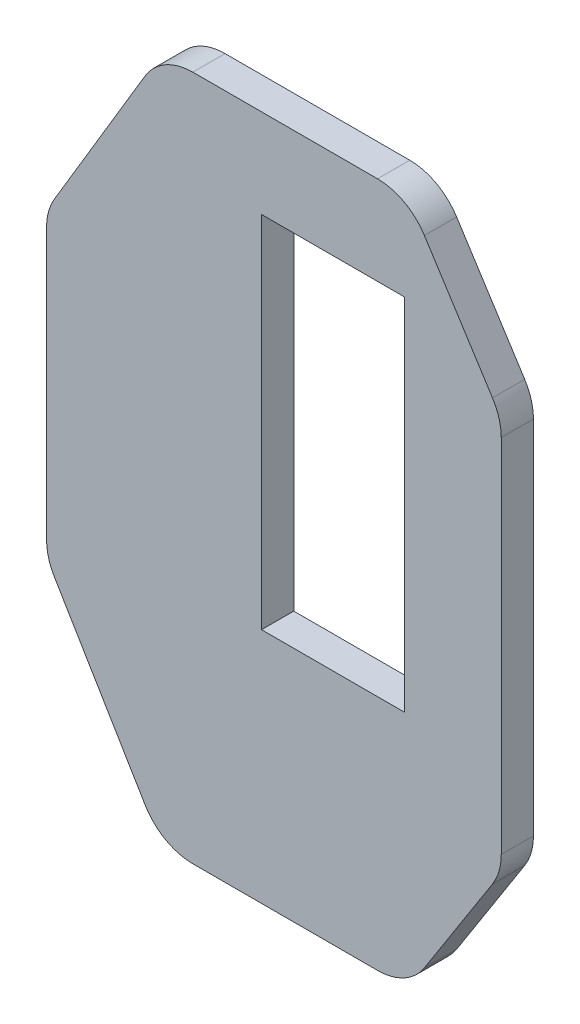
ISO-10303-21;
HEADER;
FILE_DESCRIPTION(('STEP AP214'),'2;1');
FILE_NAME('part.step','',(''),(''),'','','');
FILE_SCHEMA(('AUTOMOTIVE_DESIGN { 1 0 10303 214 1 1 1 1 }'));
ENDSEC;
DATA;
#1=APPLICATION_CONTEXT('core data for automotive mechanical design processes');
#2=APPLICATION_PROTOCOL_DEFINITION('international standard','automotive_design',2000,#1);
#3=PRODUCT_CONTEXT('',#1,'mechanical');
#4=PRODUCT('Part','Part','',(#3));
#5=PRODUCT_RELATED_PRODUCT_CATEGORY('part','',(#4));
#6=PRODUCT_DEFINITION_FORMATION('','',#4);
#7=PRODUCT_DEFINITION_CONTEXT('part definition',#1,'design');
#8=PRODUCT_DEFINITION('design','',#6,#7);
#9=PRODUCT_DEFINITION_SHAPE('','',#8);
#10=(LENGTH_UNIT() NAMED_UNIT(*) SI_UNIT(.MILLI.,.METRE.));
#11=(NAMED_UNIT(*) PLANE_ANGLE_UNIT() SI_UNIT($,.RADIAN.));
#12=(NAMED_UNIT(*) SI_UNIT($,.STERADIAN.) SOLID_ANGLE_UNIT());
#13=UNCERTAINTY_MEASURE_WITH_UNIT(LENGTH_MEASURE(1.E-05),#10,'distance_accuracy_value','');
#14=(GEOMETRIC_REPRESENTATION_CONTEXT(3) GLOBAL_UNCERTAINTY_ASSIGNED_CONTEXT((#13)) GLOBAL_UNIT_ASSIGNED_CONTEXT((#10,
#11,#12)) REPRESENTATION_CONTEXT('',''));
#15=CARTESIAN_POINT('',(0.,0.,0.));
#16=DIRECTION('',(0.,0.,1.));
#17=DIRECTION('',(1.,0.,0.));
#18=AXIS2_PLACEMENT_3D('',#15,#16,#17);
#19=CARTESIAN_POINT('',(-12.3432808407398,24.,3.));
#20=DIRECTION('',(0.,0.,1.));
#21=DIRECTION('',(1.,0.,0.));
#22=AXIS2_PLACEMENT_3D('',#19,#20,#21);
#23=PLANE('',#22);
#24=CARTESIAN_POINT('',(-12.3432808407398,24.,3.));
#25=DIRECTION('',(0.,0.,1.));
#26=DIRECTION('',(1.,0.,0.));
#27=AXIS2_PLACEMENT_3D('',#24,#25,#26);
#28=CIRCLE('',#27,5.18);
#29=CARTESIAN_POINT('',(-7.97758870210624,26.7880337427429,3.));
#30=VERTEX_POINT('',#29);
#31=CARTESIAN_POINT('',(-12.3432808407398,29.18,3.));
#32=VERTEX_POINT('',#31);
#33=EDGE_CURVE('E206',#30,#32,#28,.T.);
#34=ORIENTED_EDGE('',*,*,#33,.T.);
#35=DIRECTION('',(-1.,0.,0.));
#36=VECTOR('',#35,1.);
#37=CARTESIAN_POINT('',(-12.3432808407398,29.18,3.));
#38=LINE('',#37,#36);
#39=CARTESIAN_POINT('',(-29.5491492228105,29.18,3.));
#40=VERTEX_POINT('',#39);
#41=EDGE_CURVE('E209',#32,#40,#38,.T.);
#42=ORIENTED_EDGE('',*,*,#41,.T.);
#43=CARTESIAN_POINT('',(-29.5491492228106,24.,3.));
#44=DIRECTION('',(0.,0.,1.));
#45=DIRECTION('',(1.,0.,0.));
#46=AXIS2_PLACEMENT_3D('',#43,#44,#45);
#47=CIRCLE('',#46,5.18);
#48=CARTESIAN_POINT('',(-33.9973769314845,26.6543681454887,3.));
#49=VERTEX_POINT('',#48);
#50=EDGE_CURVE('E212',#40,#49,#47,.T.);
#51=ORIENTED_EDGE('',*,*,#50,.T.);
#52=DIRECTION('',(-0.512426282912878,-0.858731217890727,0.));
#53=VECTOR('',#52,1.);
#54=CARTESIAN_POINT('',(-33.9973769314845,26.6543681454887,3.));
#55=LINE('',#54,#53);
#56=CARTESIAN_POINT('',(-42.4482629734309,12.4922537008434,3.));
#57=VERTEX_POINT('',#56);
#58=EDGE_CURVE('E214',#49,#57,#55,.T.);
#59=ORIENTED_EDGE('',*,*,#58,.T.);
#60=CARTESIAN_POINT('',(-38.0000352647569,9.83788555535471,3.));
#61=DIRECTION('',(0.,0.,1.));
#62=DIRECTION('',(1.,0.,0.));
#63=AXIS2_PLACEMENT_3D('',#60,#61,#62);
#64=CIRCLE('',#63,5.18000000000001);
#65=CARTESIAN_POINT('',(-43.1800352647569,9.8378855553547,3.));
#66=VERTEX_POINT('',#65);
#67=EDGE_CURVE('E216',#57,#66,#64,.T.);
#68=ORIENTED_EDGE('',*,*,#67,.T.);
#69=DIRECTION('',(0.,-1.,0.));
#70=VECTOR('',#69,1.);
#71=CARTESIAN_POINT('',(-43.1800352647569,9.8378855553547,3.));
#72=LINE('',#71,#70);
#73=CARTESIAN_POINT('',(-43.1800352647569,-15.3447330300152,3.));
#74=VERTEX_POINT('',#73);
#75=EDGE_CURVE('E218',#66,#74,#72,.T.);
#76=ORIENTED_EDGE('',*,*,#75,.T.);
#77=CARTESIAN_POINT('',(-38.0000352647569,-15.3447330300152,3.));
#78=DIRECTION('',(0.,0.,1.));
#79=DIRECTION('',(1.,0.,0.));
#80=AXIS2_PLACEMENT_3D('',#77,#78,#79);
#81=CIRCLE('',#80,5.18);
#82=CARTESIAN_POINT('',(-42.4482629734309,-17.9991011755039,3.));
#83=VERTEX_POINT('',#82);
#84=EDGE_CURVE('E220',#74,#83,#81,.T.);
#85=ORIENTED_EDGE('',*,*,#84,.T.);
#86=DIRECTION('',(0.512426282912878,-0.858731217890727,0.));
#87=VECTOR('',#86,1.);
#88=CARTESIAN_POINT('',(-42.4482629734309,-17.9991011755039,3.));
#89=LINE('',#88,#87);
#90=CARTESIAN_POINT('',(-33.9973769314845,-32.1612156201491,3.));
#91=VERTEX_POINT('',#90);
#92=EDGE_CURVE('E222',#83,#91,#89,.T.);
#93=ORIENTED_EDGE('',*,*,#92,.T.);
#94=CARTESIAN_POINT('',(-29.5491492228106,-29.5068474746604,3.));
#95=DIRECTION('',(0.,0.,1.));
#96=DIRECTION('',(1.,0.,0.));
#97=AXIS2_PLACEMENT_3D('',#94,#95,#96);
#98=CIRCLE('',#97,5.18);
#99=CARTESIAN_POINT('',(-29.5491492228106,-34.6868474746604,3.));
#100=VERTEX_POINT('',#99);
#101=EDGE_CURVE('E224',#91,#100,#98,.T.);
#102=ORIENTED_EDGE('',*,*,#101,.T.);
#103=DIRECTION('',(1.,0.,0.));
#104=VECTOR('',#103,1.);
#105=CARTESIAN_POINT('',(-29.5491492228106,-34.6868474746604,3.));
#106=LINE('',#105,#104);
#107=CARTESIAN_POINT('',(-12.3432808407398,-34.6868474746604,3.));
#108=VERTEX_POINT('',#107);
#109=EDGE_CURVE('E226',#100,#108,#106,.T.);
#110=ORIENTED_EDGE('',*,*,#109,.T.);
#111=CARTESIAN_POINT('',(-12.3432808407398,-29.5068474746604,3.));
#112=DIRECTION('',(0.,0.,1.));
#113=DIRECTION('',(1.,0.,0.));
#114=AXIS2_PLACEMENT_3D('',#111,#112,#113);
#115=CIRCLE('',#114,5.18);
#116=CARTESIAN_POINT('',(-7.97758870210621,-32.2948812174033,3.));
#117=VERTEX_POINT('',#116);
#118=EDGE_CURVE('E228',#108,#117,#115,.T.);
#119=ORIENTED_EDGE('',*,*,#118,.T.);
#120=DIRECTION('',(0.538230452266974,0.842797710160919,0.));
#121=VECTOR('',#120,1.);
#122=CARTESIAN_POINT('',(-7.97758870210621,-32.2948812174033,3.));
#123=LINE('',#122,#121);
#124=CARTESIAN_POINT('',(-1.63434312612337,-22.3621975056037,3.));
#125=VERTEX_POINT('',#124);
#126=EDGE_CURVE('E230',#117,#125,#123,.T.);
#127=ORIENTED_EDGE('',*,*,#126,.T.);
#128=CARTESIAN_POINT('',(-6.00003526475691,-19.5741637628608,3.));
#129=DIRECTION('',(0.,0.,1.));
#130=DIRECTION('',(1.,0.,0.));
#131=AXIS2_PLACEMENT_3D('',#128,#129,#130);
#132=CIRCLE('',#131,5.17999999999999);
#133=CARTESIAN_POINT('',(-0.820035264756918,-19.5741637628608,3.));
#134=VERTEX_POINT('',#133);
#135=EDGE_CURVE('E232',#125,#134,#132,.T.);
#136=ORIENTED_EDGE('',*,*,#135,.T.);
#137=DIRECTION('',(0.,1.,0.));
#138=VECTOR('',#137,1.);
#139=CARTESIAN_POINT('',(-0.820035264756918,-19.5741637628608,3.));
#140=LINE('',#139,#138);
#141=CARTESIAN_POINT('',(-0.82003526475693,14.0673162882004,3.));
#142=VERTEX_POINT('',#141);
#143=EDGE_CURVE('E234',#134,#142,#140,.T.);
#144=ORIENTED_EDGE('',*,*,#143,.T.);
#145=CARTESIAN_POINT('',(-6.00003526475692,14.0673162882004,3.));
#146=DIRECTION('',(0.,0.,1.));
#147=DIRECTION('',(1.,0.,0.));
#148=AXIS2_PLACEMENT_3D('',#145,#146,#147);
#149=CIRCLE('',#148,5.17999999999999);
#150=CARTESIAN_POINT('',(-1.63434312612338,16.8553500309433,3.));
#151=VERTEX_POINT('',#150);
#152=EDGE_CURVE('E236',#142,#151,#149,.T.);
#153=ORIENTED_EDGE('',*,*,#152,.T.);
#154=DIRECTION('',(-0.538230452266976,0.842797710160918,0.));
#155=VECTOR('',#154,1.);
#156=CARTESIAN_POINT('',(-1.63434312612338,16.8553500309433,3.));
#157=LINE('',#156,#155);
#158=EDGE_CURVE('E238',#151,#30,#157,.T.);
#159=ORIENTED_EDGE('',*,*,#158,.T.);
#160=EDGE_LOOP('',(#34,#42,#51,#59,#68,#76,#85,#93,#102,#110,#119,#127,#136,#144,#153,#159));
#161=FACE_BOUND('',#160,.T.);
#162=DIRECTION('',(-1.,0.,0.));
#163=VECTOR('',#162,1.);
#164=CARTESIAN_POINT('',(-9.84982028537324,20.9,3.));
#165=LINE('',#164,#163);
#166=CARTESIAN_POINT('',(-9.84982028537324,20.9,3.));
#167=VERTEX_POINT('',#166);
#168=CARTESIAN_POINT('',(-23.1500603569878,20.9,3.));
#169=VERTEX_POINT('',#168);
#170=EDGE_CURVE('E178',#167,#169,#165,.T.);
#171=ORIENTED_EDGE('',*,*,#170,.F.);
#172=DIRECTION('',(0.,1.,0.));
#173=VECTOR('',#172,1.);
#174=CARTESIAN_POINT('',(-9.84982028537324,-12.6,3.));
#175=LINE('',#174,#173);
#176=CARTESIAN_POINT('',(-9.84982028537324,-12.6,3.));
#177=VERTEX_POINT('',#176);
#178=EDGE_CURVE('E170',#177,#167,#175,.T.);
#179=ORIENTED_EDGE('',*,*,#178,.F.);
#180=DIRECTION('',(1.,0.,0.));
#181=VECTOR('',#180,1.);
#182=CARTESIAN_POINT('',(-23.1500603569878,-12.6,3.));
#183=LINE('',#182,#181);
#184=CARTESIAN_POINT('',(-23.1500603569878,-12.6,3.));
#185=VERTEX_POINT('',#184);
#186=EDGE_CURVE('E192',#185,#177,#183,.T.);
#187=ORIENTED_EDGE('',*,*,#186,.F.);
#188=DIRECTION('',(0.,-1.,0.));
#189=VECTOR('',#188,1.);
#190=CARTESIAN_POINT('',(-23.1500603569878,20.9,3.));
#191=LINE('',#190,#189);
#192=EDGE_CURVE('E190',#169,#185,#191,.T.);
#193=ORIENTED_EDGE('',*,*,#192,.F.);
#194=EDGE_LOOP('',(#171,#179,#187,#193));
#195=FACE_BOUND('',#194,.T.);
#196=ADVANCED_FACE('F33',(#161,#195),#23,.T.);
#197=CARTESIAN_POINT('',(-12.3432808407398,24.,0.));
#198=DIRECTION('',(0.,0.,1.));
#199=DIRECTION('',(1.,0.,0.));
#200=AXIS2_PLACEMENT_3D('',#197,#198,#199);
#201=PLANE('',#200);
#202=CARTESIAN_POINT('',(-12.3432808407398,24.,0.));
#203=DIRECTION('',(0.,0.,1.));
#204=DIRECTION('',(1.,0.,0.));
#205=AXIS2_PLACEMENT_3D('',#202,#203,#204);
#206=CIRCLE('',#205,5.18);
#207=CARTESIAN_POINT('',(-7.97758870210624,26.7880337427429,0.));
#208=VERTEX_POINT('',#207);
#209=CARTESIAN_POINT('',(-12.3432808407398,29.18,0.));
#210=VERTEX_POINT('',#209);
#211=EDGE_CURVE('E186',#208,#210,#206,.T.);
#212=ORIENTED_EDGE('',*,*,#211,.F.);
#213=DIRECTION('',(-0.538230452266976,0.842797710160918,0.));
#214=VECTOR('',#213,1.);
#215=CARTESIAN_POINT('',(-1.63434312612338,16.8553500309433,0.));
#216=LINE('',#215,#214);
#217=CARTESIAN_POINT('',(-1.63434312612338,16.8553500309433,0.));
#218=VERTEX_POINT('',#217);
#219=EDGE_CURVE('E210',#218,#208,#216,.T.);
#220=ORIENTED_EDGE('',*,*,#219,.F.);
#221=CARTESIAN_POINT('',(-6.00003526475692,14.0673162882004,0.));
#222=DIRECTION('',(0.,0.,1.));
#223=DIRECTION('',(1.,0.,0.));
#224=AXIS2_PLACEMENT_3D('',#221,#222,#223);
#225=CIRCLE('',#224,5.17999999999999);
#226=CARTESIAN_POINT('',(-0.82003526475693,14.0673162882004,0.));
#227=VERTEX_POINT('',#226);
#228=EDGE_CURVE('E269',#227,#218,#225,.T.);
#229=ORIENTED_EDGE('',*,*,#228,.F.);
#230=DIRECTION('',(0.,1.,0.));
#231=VECTOR('',#230,1.);
#232=CARTESIAN_POINT('',(-0.820035264756918,-19.5741637628608,0.));
#233=LINE('',#232,#231);
#234=CARTESIAN_POINT('',(-0.820035264756918,-19.5741637628608,0.));
#235=VERTEX_POINT('',#234);
#236=EDGE_CURVE('E267',#235,#227,#233,.T.);
#237=ORIENTED_EDGE('',*,*,#236,.F.);
#238=CARTESIAN_POINT('',(-6.00003526475691,-19.5741637628608,0.));
#239=DIRECTION('',(0.,0.,1.));
#240=DIRECTION('',(1.,0.,0.));
#241=AXIS2_PLACEMENT_3D('',#238,#239,#240);
#242=CIRCLE('',#241,5.17999999999999);
#243=CARTESIAN_POINT('',(-1.63434312612337,-22.3621975056037,0.));
#244=VERTEX_POINT('',#243);
#245=EDGE_CURVE('E265',#244,#235,#242,.T.);
#246=ORIENTED_EDGE('',*,*,#245,.F.);
#247=DIRECTION('',(0.538230452266974,0.842797710160919,0.));
#248=VECTOR('',#247,1.);
#249=CARTESIAN_POINT('',(-7.97758870210621,-32.2948812174033,0.));
#250=LINE('',#249,#248);
#251=CARTESIAN_POINT('',(-7.97758870210621,-32.2948812174033,0.));
#252=VERTEX_POINT('',#251);
#253=EDGE_CURVE('E263',#252,#244,#250,.T.);
#254=ORIENTED_EDGE('',*,*,#253,.F.);
#255=CARTESIAN_POINT('',(-12.3432808407398,-29.5068474746604,0.));
#256=DIRECTION('',(0.,0.,1.));
#257=DIRECTION('',(1.,0.,0.));
#258=AXIS2_PLACEMENT_3D('',#255,#256,#257);
#259=CIRCLE('',#258,5.18);
#260=CARTESIAN_POINT('',(-12.3432808407398,-34.6868474746604,0.));
#261=VERTEX_POINT('',#260);
#262=EDGE_CURVE('E261',#261,#252,#259,.T.);
#263=ORIENTED_EDGE('',*,*,#262,.F.);
#264=DIRECTION('',(1.,0.,0.));
#265=VECTOR('',#264,1.);
#266=CARTESIAN_POINT('',(-29.5491492228106,-34.6868474746604,0.));
#267=LINE('',#266,#265);
#268=CARTESIAN_POINT('',(-29.5491492228106,-34.6868474746604,0.));
#269=VERTEX_POINT('',#268);
#270=EDGE_CURVE('E259',#269,#261,#267,.T.);
#271=ORIENTED_EDGE('',*,*,#270,.F.);
#272=CARTESIAN_POINT('',(-29.5491492228106,-29.5068474746604,0.));
#273=DIRECTION('',(0.,0.,1.));
#274=DIRECTION('',(1.,0.,0.));
#275=AXIS2_PLACEMENT_3D('',#272,#273,#274);
#276=CIRCLE('',#275,5.18);
#277=CARTESIAN_POINT('',(-33.9973769314845,-32.1612156201491,0.));
#278=VERTEX_POINT('',#277);
#279=EDGE_CURVE('E257',#278,#269,#276,.T.);
#280=ORIENTED_EDGE('',*,*,#279,.F.);
#281=DIRECTION('',(0.512426282912878,-0.858731217890727,0.));
#282=VECTOR('',#281,1.);
#283=CARTESIAN_POINT('',(-42.4482629734309,-17.9991011755039,0.));
#284=LINE('',#283,#282);
#285=CARTESIAN_POINT('',(-42.4482629734309,-17.9991011755039,0.));
#286=VERTEX_POINT('',#285);
#287=EDGE_CURVE('E255',#286,#278,#284,.T.);
#288=ORIENTED_EDGE('',*,*,#287,.F.);
#289=CARTESIAN_POINT('',(-38.0000352647569,-15.3447330300152,0.));
#290=DIRECTION('',(0.,0.,1.));
#291=DIRECTION('',(1.,0.,0.));
#292=AXIS2_PLACEMENT_3D('',#289,#290,#291);
#293=CIRCLE('',#292,5.18);
#294=CARTESIAN_POINT('',(-43.1800352647569,-15.3447330300152,0.));
#295=VERTEX_POINT('',#294);
#296=EDGE_CURVE('E253',#295,#286,#293,.T.);
#297=ORIENTED_EDGE('',*,*,#296,.F.);
#298=DIRECTION('',(0.,-1.,0.));
#299=VECTOR('',#298,1.);
#300=CARTESIAN_POINT('',(-43.1800352647569,9.8378855553547,0.));
#301=LINE('',#300,#299);
#302=CARTESIAN_POINT('',(-43.1800352647569,9.8378855553547,0.));
#303=VERTEX_POINT('',#302);
#304=EDGE_CURVE('E251',#303,#295,#301,.T.);
#305=ORIENTED_EDGE('',*,*,#304,.F.);
#306=CARTESIAN_POINT('',(-38.0000352647569,9.83788555535471,0.));
#307=DIRECTION('',(0.,0.,1.));
#308=DIRECTION('',(1.,0.,0.));
#309=AXIS2_PLACEMENT_3D('',#306,#307,#308);
#310=CIRCLE('',#309,5.18000000000001);
#311=CARTESIAN_POINT('',(-42.4482629734309,12.4922537008434,0.));
#312=VERTEX_POINT('',#311);
#313=EDGE_CURVE('E249',#312,#303,#310,.T.);
#314=ORIENTED_EDGE('',*,*,#313,.F.);
#315=DIRECTION('',(-0.512426282912878,-0.858731217890727,0.));
#316=VECTOR('',#315,1.);
#317=CARTESIAN_POINT('',(-33.9973769314845,26.6543681454887,0.));
#318=LINE('',#317,#316);
#319=CARTESIAN_POINT('',(-33.9973769314845,26.6543681454887,0.));
#320=VERTEX_POINT('',#319);
#321=EDGE_CURVE('E247',#320,#312,#318,.T.);
#322=ORIENTED_EDGE('',*,*,#321,.F.);
#323=CARTESIAN_POINT('',(-29.5491492228106,24.,0.));
#324=DIRECTION('',(0.,0.,1.));
#325=DIRECTION('',(1.,0.,0.));
#326=AXIS2_PLACEMENT_3D('',#323,#324,#325);
#327=CIRCLE('',#326,5.18);
#328=CARTESIAN_POINT('',(-29.5491492228105,29.18,0.));
#329=VERTEX_POINT('',#328);
#330=EDGE_CURVE('E245',#329,#320,#327,.T.);
#331=ORIENTED_EDGE('',*,*,#330,.F.);
#332=DIRECTION('',(-1.,0.,0.));
#333=VECTOR('',#332,1.);
#334=CARTESIAN_POINT('',(-12.3432808407398,29.18,0.));
#335=LINE('',#334,#333);
#336=EDGE_CURVE('E243',#210,#329,#335,.T.);
#337=ORIENTED_EDGE('',*,*,#336,.F.);
#338=EDGE_LOOP('',(#212,#220,#229,#237,#246,#254,#263,#271,#280,#288,#297,#305,#314,#322,#331,#337));
#339=FACE_BOUND('',#338,.T.);
#340=DIRECTION('',(0.,1.,0.));
#341=VECTOR('',#340,1.);
#342=CARTESIAN_POINT('',(-9.84982028537324,-12.6,0.));
#343=LINE('',#342,#341);
#344=CARTESIAN_POINT('',(-9.84982028537324,-12.6,0.));
#345=VERTEX_POINT('',#344);
#346=CARTESIAN_POINT('',(-9.84982028537324,20.9,0.));
#347=VERTEX_POINT('',#346);
#348=EDGE_CURVE('E56',#345,#347,#343,.T.);
#349=ORIENTED_EDGE('',*,*,#348,.T.);
#350=DIRECTION('',(-1.,0.,0.));
#351=VECTOR('',#350,1.);
#352=CARTESIAN_POINT('',(-9.84982028537324,20.9,0.));
#353=LINE('',#352,#351);
#354=CARTESIAN_POINT('',(-23.1500603569878,20.9,0.));
#355=VERTEX_POINT('',#354);
#356=EDGE_CURVE('E185',#347,#355,#353,.T.);
#357=ORIENTED_EDGE('',*,*,#356,.T.);
#358=DIRECTION('',(0.,-1.,0.));
#359=VECTOR('',#358,1.);
#360=CARTESIAN_POINT('',(-23.1500603569878,20.9,0.));
#361=LINE('',#360,#359);
#362=CARTESIAN_POINT('',(-23.1500603569878,-12.6,0.));
#363=VERTEX_POINT('',#362);
#364=EDGE_CURVE('E198',#355,#363,#361,.T.);
#365=ORIENTED_EDGE('',*,*,#364,.T.);
#366=DIRECTION('',(1.,0.,0.));
#367=VECTOR('',#366,1.);
#368=CARTESIAN_POINT('',(-23.1500603569878,-12.6,0.));
#369=LINE('',#368,#367);
#370=EDGE_CURVE('E179',#363,#345,#369,.T.);
#371=ORIENTED_EDGE('',*,*,#370,.T.);
#372=EDGE_LOOP('',(#349,#357,#365,#371));
#373=FACE_BOUND('',#372,.T.);
#374=ADVANCED_FACE('F323',(#339,#373),#201,.F.);
#375=CARTESIAN_POINT('',(-12.3432808407398,24.,3.));
#376=DIRECTION('',(0.,0.,-1.));
#377=DIRECTION('',(-1.,0.,0.));
#378=AXIS2_PLACEMENT_3D('',#375,#376,#377);
#379=CYLINDRICAL_SURFACE('',#378,5.18);
#380=ORIENTED_EDGE('',*,*,#211,.T.);
#381=DIRECTION('',(0.,0.,-1.));
#382=VECTOR('',#381,1.);
#383=CARTESIAN_POINT('',(-12.3432808407398,29.18,3.));
#384=LINE('',#383,#382);
#385=EDGE_CURVE('E11',#32,#210,#384,.T.);
#386=ORIENTED_EDGE('',*,*,#385,.F.);
#387=ORIENTED_EDGE('',*,*,#33,.F.);
#388=DIRECTION('',(0.,0.,-1.));
#389=VECTOR('',#388,1.);
#390=CARTESIAN_POINT('',(-7.97758870210624,26.7880337427429,3.));
#391=LINE('',#390,#389);
#392=EDGE_CURVE('E240',#30,#208,#391,.T.);
#393=ORIENTED_EDGE('',*,*,#392,.T.);
#394=EDGE_LOOP('',(#380,#386,#387,#393));
#395=FACE_BOUND('',#394,.T.);
#396=ADVANCED_FACE('F35',(#395),#379,.T.);
#397=CARTESIAN_POINT('',(-12.3432808407398,29.18,3.));
#398=DIRECTION('',(0.,-1.,0.));
#399=DIRECTION('',(1.,0.,0.));
#400=AXIS2_PLACEMENT_3D('',#397,#398,#399);
#401=PLANE('',#400);
#402=ORIENTED_EDGE('',*,*,#336,.T.);
#403=DIRECTION('',(0.,0.,-1.));
#404=VECTOR('',#403,1.);
#405=CARTESIAN_POINT('',(-29.5491492228105,29.18,3.));
#406=LINE('',#405,#404);
#407=EDGE_CURVE('E41',#40,#329,#406,.T.);
#408=ORIENTED_EDGE('',*,*,#407,.F.);
#409=ORIENTED_EDGE('',*,*,#41,.F.);
#410=ORIENTED_EDGE('',*,*,#385,.T.);
#411=EDGE_LOOP('',(#402,#408,#409,#410));
#412=FACE_BOUND('',#411,.T.);
#413=ADVANCED_FACE('F340',(#412),#401,.F.);
#414=CARTESIAN_POINT('',(-29.5491492228106,24.,3.));
#415=DIRECTION('',(0.,0.,-1.));
#416=DIRECTION('',(-1.,0.,0.));
#417=AXIS2_PLACEMENT_3D('',#414,#415,#416);
#418=CYLINDRICAL_SURFACE('',#417,5.18);
#419=ORIENTED_EDGE('',*,*,#330,.T.);
#420=DIRECTION('',(0.,0.,-1.));
#421=VECTOR('',#420,1.);
#422=CARTESIAN_POINT('',(-33.9973769314845,26.6543681454887,3.));
#423=LINE('',#422,#421);
#424=EDGE_CURVE('E310',#49,#320,#423,.T.);
#425=ORIENTED_EDGE('',*,*,#424,.F.);
#426=ORIENTED_EDGE('',*,*,#50,.F.);
#427=ORIENTED_EDGE('',*,*,#407,.T.);
#428=EDGE_LOOP('',(#419,#425,#426,#427));
#429=FACE_BOUND('',#428,.T.);
#430=ADVANCED_FACE('F317',(#429),#418,.T.);
#431=CARTESIAN_POINT('',(-33.9973769314845,26.6543681454887,3.));
#432=DIRECTION('',(0.858731217890727,-0.512426282912878,0.));
#433=DIRECTION('',(0.512426282912878,0.858731217890727,0.));
#434=AXIS2_PLACEMENT_3D('',#431,#432,#433);
#435=PLANE('',#434);
#436=ORIENTED_EDGE('',*,*,#321,.T.);
#437=DIRECTION('',(0.,0.,-1.));
#438=VECTOR('',#437,1.);
#439=CARTESIAN_POINT('',(-42.4482629734309,12.4922537008434,3.));
#440=LINE('',#439,#438);
#441=EDGE_CURVE('E307',#57,#312,#440,.T.);
#442=ORIENTED_EDGE('',*,*,#441,.F.);
#443=ORIENTED_EDGE('',*,*,#58,.F.);
#444=ORIENTED_EDGE('',*,*,#424,.T.);
#445=EDGE_LOOP('',(#436,#442,#443,#444));
#446=FACE_BOUND('',#445,.T.);
#447=ADVANCED_FACE('F329',(#446),#435,.F.);
#448=CARTESIAN_POINT('',(-38.0000352647569,9.83788555535471,3.));
#449=DIRECTION('',(0.,0.,-1.));
#450=DIRECTION('',(-1.,0.,0.));
#451=AXIS2_PLACEMENT_3D('',#448,#449,#450);
#452=CYLINDRICAL_SURFACE('',#451,5.18000000000001);
#453=ORIENTED_EDGE('',*,*,#313,.T.);
#454=DIRECTION('',(0.,0.,-1.));
#455=VECTOR('',#454,1.);
#456=CARTESIAN_POINT('',(-43.1800352647569,9.8378855553547,3.));
#457=LINE('',#456,#455);
#458=EDGE_CURVE('E304',#66,#303,#457,.T.);
#459=ORIENTED_EDGE('',*,*,#458,.F.);
#460=ORIENTED_EDGE('',*,*,#67,.F.);
#461=ORIENTED_EDGE('',*,*,#441,.T.);
#462=EDGE_LOOP('',(#453,#459,#460,#461));
#463=FACE_BOUND('',#462,.T.);
#464=ADVANCED_FACE('F333',(#463),#452,.T.);
#465=CARTESIAN_POINT('',(-43.1800352647569,9.8378855553547,3.));
#466=DIRECTION('',(1.,0.,0.));
#467=DIRECTION('',(0.,1.,0.));
#468=AXIS2_PLACEMENT_3D('',#465,#466,#467);
#469=PLANE('',#468);
#470=ORIENTED_EDGE('',*,*,#304,.T.);
#471=DIRECTION('',(0.,0.,-1.));
#472=VECTOR('',#471,1.);
#473=CARTESIAN_POINT('',(-43.1800352647569,-15.3447330300152,3.));
#474=LINE('',#473,#472);
#475=EDGE_CURVE('E301',#74,#295,#474,.T.);
#476=ORIENTED_EDGE('',*,*,#475,.F.);
#477=ORIENTED_EDGE('',*,*,#75,.F.);
#478=ORIENTED_EDGE('',*,*,#458,.T.);
#479=EDGE_LOOP('',(#470,#476,#477,#478));
#480=FACE_BOUND('',#479,.T.);
#481=ADVANCED_FACE('F393',(#480),#469,.F.);
#482=CARTESIAN_POINT('',(-38.0000352647569,-15.3447330300152,3.));
#483=DIRECTION('',(0.,0.,-1.));
#484=DIRECTION('',(-1.,0.,0.));
#485=AXIS2_PLACEMENT_3D('',#482,#483,#484);
#486=CYLINDRICAL_SURFACE('',#485,5.18);
#487=ORIENTED_EDGE('',*,*,#296,.T.);
#488=DIRECTION('',(0.,0.,-1.));
#489=VECTOR('',#488,1.);
#490=CARTESIAN_POINT('',(-42.4482629734309,-17.9991011755039,3.));
#491=LINE('',#490,#489);
#492=EDGE_CURVE('E298',#83,#286,#491,.T.);
#493=ORIENTED_EDGE('',*,*,#492,.F.);
#494=ORIENTED_EDGE('',*,*,#84,.F.);
#495=ORIENTED_EDGE('',*,*,#475,.T.);
#496=EDGE_LOOP('',(#487,#493,#494,#495));
#497=FACE_BOUND('',#496,.T.);
#498=ADVANCED_FACE('F390',(#497),#486,.T.);
#499=CARTESIAN_POINT('',(-42.4482629734309,-17.9991011755039,3.));
#500=DIRECTION('',(0.858731217890727,0.512426282912878,0.));
#501=DIRECTION('',(-0.512426282912878,0.858731217890727,0.));
#502=AXIS2_PLACEMENT_3D('',#499,#500,#501);
#503=PLANE('',#502);
#504=ORIENTED_EDGE('',*,*,#287,.T.);
#505=DIRECTION('',(0.,0.,-1.));
#506=VECTOR('',#505,1.);
#507=CARTESIAN_POINT('',(-33.9973769314845,-32.1612156201491,3.));
#508=LINE('',#507,#506);
#509=EDGE_CURVE('E295',#91,#278,#508,.T.);
#510=ORIENTED_EDGE('',*,*,#509,.F.);
#511=ORIENTED_EDGE('',*,*,#92,.F.);
#512=ORIENTED_EDGE('',*,*,#492,.T.);
#513=EDGE_LOOP('',(#504,#510,#511,#512));
#514=FACE_BOUND('',#513,.T.);
#515=ADVANCED_FACE('F386',(#514),#503,.F.);
#516=CARTESIAN_POINT('',(-29.5491492228106,-29.5068474746604,3.));
#517=DIRECTION('',(0.,0.,-1.));
#518=DIRECTION('',(-1.,0.,0.));
#519=AXIS2_PLACEMENT_3D('',#516,#517,#518);
#520=CYLINDRICAL_SURFACE('',#519,5.18);
#521=ORIENTED_EDGE('',*,*,#279,.T.);
#522=DIRECTION('',(0.,0.,-1.));
#523=VECTOR('',#522,1.);
#524=CARTESIAN_POINT('',(-29.5491492228106,-34.6868474746604,3.));
#525=LINE('',#524,#523);
#526=EDGE_CURVE('E292',#100,#269,#525,.T.);
#527=ORIENTED_EDGE('',*,*,#526,.F.);
#528=ORIENTED_EDGE('',*,*,#101,.F.);
#529=ORIENTED_EDGE('',*,*,#509,.T.);
#530=EDGE_LOOP('',(#521,#527,#528,#529));
#531=FACE_BOUND('',#530,.T.);
#532=ADVANCED_FACE('F382',(#531),#520,.T.);
#533=CARTESIAN_POINT('',(-29.5491492228106,-34.6868474746604,3.));
#534=DIRECTION('',(0.,1.,0.));
#535=DIRECTION('',(0.,0.,1.));
#536=AXIS2_PLACEMENT_3D('',#533,#534,#535);
#537=PLANE('',#536);
#538=ORIENTED_EDGE('',*,*,#270,.T.);
#539=DIRECTION('',(0.,0.,-1.));
#540=VECTOR('',#539,1.);
#541=CARTESIAN_POINT('',(-12.3432808407398,-34.6868474746604,3.));
#542=LINE('',#541,#540);
#543=EDGE_CURVE('E289',#108,#261,#542,.T.);
#544=ORIENTED_EDGE('',*,*,#543,.F.);
#545=ORIENTED_EDGE('',*,*,#109,.F.);
#546=ORIENTED_EDGE('',*,*,#526,.T.);
#547=EDGE_LOOP('',(#538,#544,#545,#546));
#548=FACE_BOUND('',#547,.T.);
#549=ADVANCED_FACE('F377',(#548),#537,.F.);
#550=CARTESIAN_POINT('',(-12.3432808407398,-29.5068474746604,3.));
#551=DIRECTION('',(0.,0.,-1.));
#552=DIRECTION('',(-1.,0.,0.));
#553=AXIS2_PLACEMENT_3D('',#550,#551,#552);
#554=CYLINDRICAL_SURFACE('',#553,5.18);
#555=ORIENTED_EDGE('',*,*,#262,.T.);
#556=DIRECTION('',(0.,0.,-1.));
#557=VECTOR('',#556,1.);
#558=CARTESIAN_POINT('',(-7.97758870210621,-32.2948812174033,3.));
#559=LINE('',#558,#557);
#560=EDGE_CURVE('E286',#117,#252,#559,.T.);
#561=ORIENTED_EDGE('',*,*,#560,.F.);
#562=ORIENTED_EDGE('',*,*,#118,.F.);
#563=ORIENTED_EDGE('',*,*,#543,.T.);
#564=EDGE_LOOP('',(#555,#561,#562,#563));
#565=FACE_BOUND('',#564,.T.);
#566=ADVANCED_FACE('F371',(#565),#554,.T.);
#567=CARTESIAN_POINT('',(-7.97758870210621,-32.2948812174033,3.));
#568=DIRECTION('',(-0.842797710160919,0.538230452266974,0.));
#569=DIRECTION('',(-0.538230452266974,-0.842797710160919,0.));
#570=AXIS2_PLACEMENT_3D('',#567,#568,#569);
#571=PLANE('',#570);
#572=ORIENTED_EDGE('',*,*,#253,.T.);
#573=DIRECTION('',(0.,0.,-1.));
#574=VECTOR('',#573,1.);
#575=CARTESIAN_POINT('',(-1.63434312612337,-22.3621975056037,3.));
#576=LINE('',#575,#574);
#577=EDGE_CURVE('E283',#125,#244,#576,.T.);
#578=ORIENTED_EDGE('',*,*,#577,.F.);
#579=ORIENTED_EDGE('',*,*,#126,.F.);
#580=ORIENTED_EDGE('',*,*,#560,.T.);
#581=EDGE_LOOP('',(#572,#578,#579,#580));
#582=FACE_BOUND('',#581,.T.);
#583=ADVANCED_FACE('F367',(#582),#571,.F.);
#584=CARTESIAN_POINT('',(-6.00003526475691,-19.5741637628608,3.));
#585=DIRECTION('',(0.,0.,-1.));
#586=DIRECTION('',(-1.,0.,0.));
#587=AXIS2_PLACEMENT_3D('',#584,#585,#586);
#588=CYLINDRICAL_SURFACE('',#587,5.17999999999999);
#589=ORIENTED_EDGE('',*,*,#245,.T.);
#590=DIRECTION('',(0.,0.,-1.));
#591=VECTOR('',#590,1.);
#592=CARTESIAN_POINT('',(-0.820035264756918,-19.5741637628608,3.));
#593=LINE('',#592,#591);
#594=EDGE_CURVE('E280',#134,#235,#593,.T.);
#595=ORIENTED_EDGE('',*,*,#594,.F.);
#596=ORIENTED_EDGE('',*,*,#135,.F.);
#597=ORIENTED_EDGE('',*,*,#577,.T.);
#598=EDGE_LOOP('',(#589,#595,#596,#597));
#599=FACE_BOUND('',#598,.T.);
#600=ADVANCED_FACE('F362',(#599),#588,.T.);
#601=CARTESIAN_POINT('',(-0.820035264756918,-19.5741637628608,3.));
#602=DIRECTION('',(-1.,0.,0.));
#603=DIRECTION('',(0.,-1.,0.));
#604=AXIS2_PLACEMENT_3D('',#601,#602,#603);
#605=PLANE('',#604);
#606=ORIENTED_EDGE('',*,*,#236,.T.);
#607=DIRECTION('',(0.,0.,-1.));
#608=VECTOR('',#607,1.);
#609=CARTESIAN_POINT('',(-0.82003526475693,14.0673162882004,3.));
#610=LINE('',#609,#608);
#611=EDGE_CURVE('E277',#142,#227,#610,.T.);
#612=ORIENTED_EDGE('',*,*,#611,.F.);
#613=ORIENTED_EDGE('',*,*,#143,.F.);
#614=ORIENTED_EDGE('',*,*,#594,.T.);
#615=EDGE_LOOP('',(#606,#612,#613,#614));
#616=FACE_BOUND('',#615,.T.);
#617=ADVANCED_FACE('F356',(#616),#605,.F.);
#618=CARTESIAN_POINT('',(-6.00003526475692,14.0673162882004,3.));
#619=DIRECTION('',(0.,0.,-1.));
#620=DIRECTION('',(-1.,0.,0.));
#621=AXIS2_PLACEMENT_3D('',#618,#619,#620);
#622=CYLINDRICAL_SURFACE('',#621,5.17999999999999);
#623=ORIENTED_EDGE('',*,*,#228,.T.);
#624=DIRECTION('',(0.,0.,-1.));
#625=VECTOR('',#624,1.);
#626=CARTESIAN_POINT('',(-1.63434312612338,16.8553500309433,3.));
#627=LINE('',#626,#625);
#628=EDGE_CURVE('E274',#151,#218,#627,.T.);
#629=ORIENTED_EDGE('',*,*,#628,.F.);
#630=ORIENTED_EDGE('',*,*,#152,.F.);
#631=ORIENTED_EDGE('',*,*,#611,.T.);
#632=EDGE_LOOP('',(#623,#629,#630,#631));
#633=FACE_BOUND('',#632,.T.);
#634=ADVANCED_FACE('F352',(#633),#622,.T.);
#635=CARTESIAN_POINT('',(-1.63434312612338,16.8553500309433,3.));
#636=DIRECTION('',(-0.842797710160918,-0.538230452266976,0.));
#637=DIRECTION('',(0.538230452266976,-0.842797710160918,0.));
#638=AXIS2_PLACEMENT_3D('',#635,#636,#637);
#639=PLANE('',#638);
#640=ORIENTED_EDGE('',*,*,#219,.T.);
#641=ORIENTED_EDGE('',*,*,#392,.F.);
#642=ORIENTED_EDGE('',*,*,#158,.F.);
#643=ORIENTED_EDGE('',*,*,#628,.T.);
#644=EDGE_LOOP('',(#640,#641,#642,#643));
#645=FACE_BOUND('',#644,.T.);
#646=ADVANCED_FACE('F347',(#645),#639,.F.);
#647=CARTESIAN_POINT('',(-9.84982028537324,-12.6,3.));
#648=DIRECTION('',(-1.,0.,0.));
#649=DIRECTION('',(0.,0.,1.));
#650=AXIS2_PLACEMENT_3D('',#647,#648,#649);
#651=PLANE('',#650);
#652=ORIENTED_EDGE('',*,*,#348,.F.);
#653=DIRECTION('',(0.,0.,-1.));
#654=VECTOR('',#653,1.);
#655=CARTESIAN_POINT('',(-9.84982028537324,-12.6,3.));
#656=LINE('',#655,#654);
#657=EDGE_CURVE('E174',#177,#345,#656,.T.);
#658=ORIENTED_EDGE('',*,*,#657,.F.);
#659=ORIENTED_EDGE('',*,*,#178,.T.);
#660=DIRECTION('',(0.,0.,-1.));
#661=VECTOR('',#660,1.);
#662=CARTESIAN_POINT('',(-9.84982028537324,20.9,3.));
#663=LINE('',#662,#661);
#664=EDGE_CURVE('E173',#167,#347,#663,.T.);
#665=ORIENTED_EDGE('',*,*,#664,.T.);
#666=EDGE_LOOP('',(#652,#658,#659,#665));
#667=FACE_BOUND('',#666,.T.);
#668=ADVANCED_FACE('F172',(#667),#651,.T.);
#669=CARTESIAN_POINT('',(-9.84982028537324,20.9,3.));
#670=DIRECTION('',(0.,-1.,0.));
#671=DIRECTION('',(1.,0.,0.));
#672=AXIS2_PLACEMENT_3D('',#669,#670,#671);
#673=PLANE('',#672);
#674=ORIENTED_EDGE('',*,*,#356,.F.);
#675=ORIENTED_EDGE('',*,*,#664,.F.);
#676=ORIENTED_EDGE('',*,*,#170,.T.);
#677=DIRECTION('',(0.,0.,-1.));
#678=VECTOR('',#677,1.);
#679=CARTESIAN_POINT('',(-23.1500603569878,20.9,3.));
#680=LINE('',#679,#678);
#681=EDGE_CURVE('E187',#169,#355,#680,.T.);
#682=ORIENTED_EDGE('',*,*,#681,.T.);
#683=EDGE_LOOP('',(#674,#675,#676,#682));
#684=FACE_BOUND('',#683,.T.);
#685=ADVANCED_FACE('F182',(#684),#673,.T.);
#686=CARTESIAN_POINT('',(-23.1500603569878,20.9,3.));
#687=DIRECTION('',(1.,0.,0.));
#688=DIRECTION('',(0.,0.,-1.));
#689=AXIS2_PLACEMENT_3D('',#686,#687,#688);
#690=PLANE('',#689);
#691=ORIENTED_EDGE('',*,*,#364,.F.);
#692=ORIENTED_EDGE('',*,*,#681,.F.);
#693=ORIENTED_EDGE('',*,*,#192,.T.);
#694=DIRECTION('',(0.,0.,-1.));
#695=VECTOR('',#694,1.);
#696=CARTESIAN_POINT('',(-23.1500603569878,-12.6,3.));
#697=LINE('',#696,#695);
#698=EDGE_CURVE('E48',#185,#363,#697,.T.);
#699=ORIENTED_EDGE('',*,*,#698,.T.);
#700=EDGE_LOOP('',(#691,#692,#693,#699));
#701=FACE_BOUND('',#700,.T.);
#702=ADVANCED_FACE('F475',(#701),#690,.T.);
#703=CARTESIAN_POINT('',(-23.1500603569878,-12.6,3.));
#704=DIRECTION('',(0.,1.,0.));
#705=DIRECTION('',(-1.,0.,0.));
#706=AXIS2_PLACEMENT_3D('',#703,#704,#705);
#707=PLANE('',#706);
#708=ORIENTED_EDGE('',*,*,#370,.F.);
#709=ORIENTED_EDGE('',*,*,#698,.F.);
#710=ORIENTED_EDGE('',*,*,#186,.T.);
#711=ORIENTED_EDGE('',*,*,#657,.T.);
#712=EDGE_LOOP('',(#708,#709,#710,#711));
#713=FACE_BOUND('',#712,.T.);
#714=ADVANCED_FACE('F481',(#713),#707,.T.);
#715=CLOSED_SHELL('',(#196,#374,#396,#413,#430,#447,#464,#481,#498,#515,#532,#549,#566,#583,
#600,#617,#634,#646,#668,#685,#702,#714));
#716=MANIFOLD_SOLID_BREP('B2',#715);
#717=ADVANCED_BREP_SHAPE_REPRESENTATION('',(#18,#716),#14);
#718=SHAPE_DEFINITION_REPRESENTATION(#9,#717);
ENDSEC;
END-ISO-10303-21;
